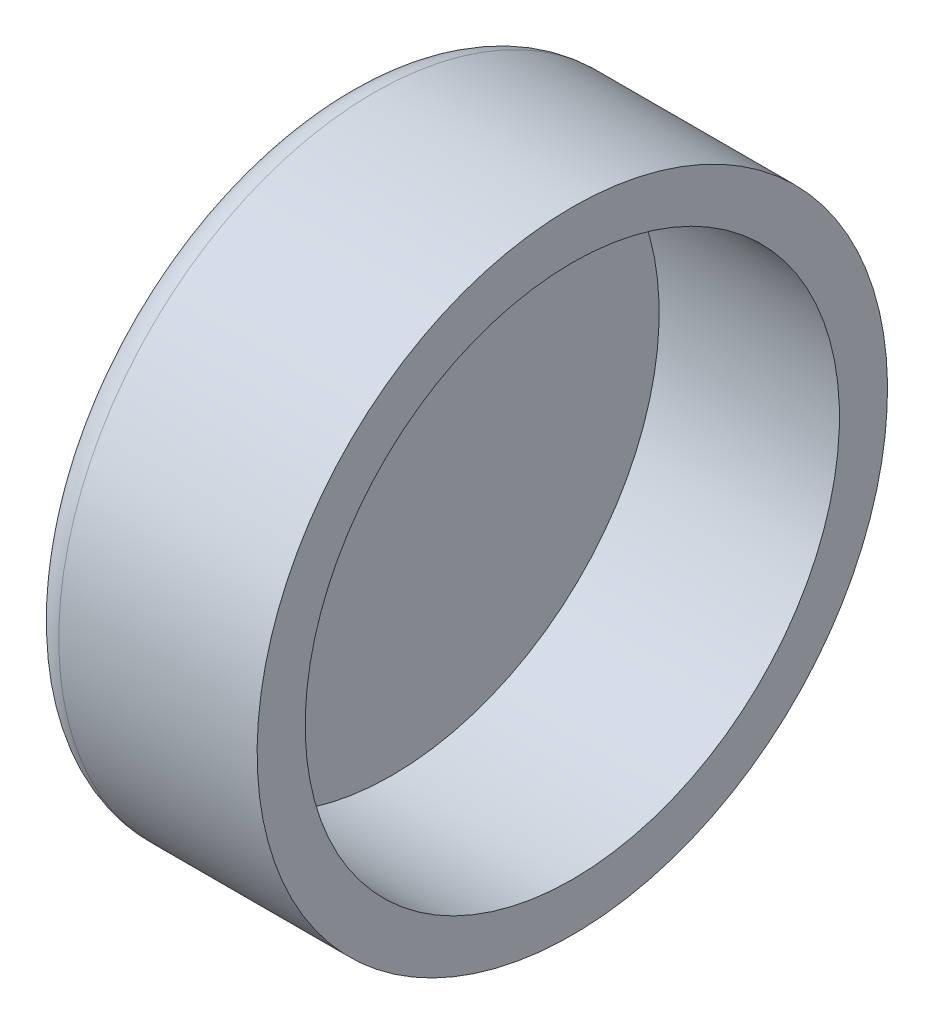
ISO-10303-21;
HEADER;
FILE_DESCRIPTION(('STEP AP214'),'2;1');
FILE_NAME('part.step','',(''),(''),'','','');
FILE_SCHEMA(('AUTOMOTIVE_DESIGN { 1 0 10303 214 1 1 1 1 }'));
ENDSEC;
DATA;
#1=APPLICATION_CONTEXT('core data for automotive mechanical design processes');
#2=APPLICATION_PROTOCOL_DEFINITION('international standard','automotive_design',2000,#1);
#3=PRODUCT_CONTEXT('',#1,'mechanical');
#4=PRODUCT('Part','Part','',(#3));
#5=PRODUCT_RELATED_PRODUCT_CATEGORY('part','',(#4));
#6=PRODUCT_DEFINITION_FORMATION('','',#4);
#7=PRODUCT_DEFINITION_CONTEXT('part definition',#1,'design');
#8=PRODUCT_DEFINITION('design','',#6,#7);
#9=PRODUCT_DEFINITION_SHAPE('','',#8);
#10=(LENGTH_UNIT() NAMED_UNIT(*) SI_UNIT(.MILLI.,.METRE.));
#11=(NAMED_UNIT(*) PLANE_ANGLE_UNIT() SI_UNIT($,.RADIAN.));
#12=(NAMED_UNIT(*) SI_UNIT($,.STERADIAN.) SOLID_ANGLE_UNIT());
#13=UNCERTAINTY_MEASURE_WITH_UNIT(LENGTH_MEASURE(1.E-05),#10,'distance_accuracy_value','');
#14=(GEOMETRIC_REPRESENTATION_CONTEXT(3) GLOBAL_UNCERTAINTY_ASSIGNED_CONTEXT((#13)) GLOBAL_UNIT_ASSIGNED_CONTEXT((#10,
#11,#12)) REPRESENTATION_CONTEXT('',''));
#15=CARTESIAN_POINT('',(0.,0.,0.));
#16=DIRECTION('',(0.,0.,1.));
#17=DIRECTION('',(1.,0.,0.));
#18=AXIS2_PLACEMENT_3D('',#15,#16,#17);
#19=CARTESIAN_POINT('',(0.,44.45,0.));
#20=DIRECTION('',(1.,0.,0.));
#21=DIRECTION('',(0.,1.,0.));
#22=AXIS2_PLACEMENT_3D('',#19,#20,#21);
#23=PLANE('',#22);
#24=CARTESIAN_POINT('',(0.,0.,0.));
#25=DIRECTION('',(1.,0.,0.));
#26=DIRECTION('',(0.,1.,0.));
#27=AXIS2_PLACEMENT_3D('',#24,#25,#26);
#28=CIRCLE('',#27,52.45);
#29=CARTESIAN_POINT('',(0.,52.45,0.));
#30=VERTEX_POINT('',#29);
#31=EDGE_CURVE('E53',#30,#30,#28,.T.);
#32=ORIENTED_EDGE('',*,*,#31,.T.);
#33=EDGE_LOOP('',(#32));
#34=FACE_BOUND('',#33,.T.);
#35=CARTESIAN_POINT('',(0.,0.,0.));
#36=DIRECTION('',(1.,0.,0.));
#37=DIRECTION('',(0.,1.,0.));
#38=AXIS2_PLACEMENT_3D('',#35,#36,#37);
#39=CIRCLE('',#38,44.45);
#40=CARTESIAN_POINT('',(0.,44.45,0.));
#41=VERTEX_POINT('',#40);
#42=EDGE_CURVE('E62',#41,#41,#39,.T.);
#43=ORIENTED_EDGE('',*,*,#42,.F.);
#44=EDGE_LOOP('',(#43));
#45=FACE_BOUND('',#44,.T.);
#46=ADVANCED_FACE('F42',(#34,#45),#23,.T.);
#47=CARTESIAN_POINT('',(-30.,0.,0.));
#48=DIRECTION('',(1.,0.,0.));
#49=DIRECTION('',(0.,1.,0.));
#50=AXIS2_PLACEMENT_3D('',#47,#48,#49);
#51=CYLINDRICAL_SURFACE('',#50,52.45);
#52=CARTESIAN_POINT('',(-33.,0.,0.));
#53=DIRECTION('',(-1.,0.,0.));
#54=DIRECTION('',(0.,-1.,0.));
#55=AXIS2_PLACEMENT_3D('',#52,#53,#54);
#56=CIRCLE('',#55,52.45);
#57=CARTESIAN_POINT('',(-33.,-52.45,0.));
#58=VERTEX_POINT('',#57);
#59=EDGE_CURVE('E49',#58,#58,#56,.F.);
#60=ORIENTED_EDGE('',*,*,#59,.T.);
#61=EDGE_LOOP('',(#60));
#62=FACE_BOUND('',#61,.T.);
#63=ORIENTED_EDGE('',*,*,#31,.F.);
#64=EDGE_LOOP('',(#63));
#65=FACE_BOUND('',#64,.T.);
#66=ADVANCED_FACE('F70',(#62,#65),#51,.T.);
#67=CARTESIAN_POINT('',(-38.,52.45,0.));
#68=DIRECTION('',(-1.,0.,0.));
#69=DIRECTION('',(0.,-1.,0.));
#70=AXIS2_PLACEMENT_3D('',#67,#68,#69);
#71=PLANE('',#70);
#72=CARTESIAN_POINT('',(-38.,0.,0.));
#73=DIRECTION('',(-1.,0.,0.));
#74=DIRECTION('',(0.,-1.,0.));
#75=AXIS2_PLACEMENT_3D('',#72,#73,#74);
#76=CIRCLE('',#75,47.45);
#77=CARTESIAN_POINT('',(-38.,-47.45,0.));
#78=VERTEX_POINT('',#77);
#79=EDGE_CURVE('E12',#78,#78,#76,.T.);
#80=ORIENTED_EDGE('',*,*,#79,.T.);
#81=EDGE_LOOP('',(#80));
#82=FACE_BOUND('',#81,.T.);
#83=ADVANCED_FACE('F75',(#82),#71,.T.);
#84=CARTESIAN_POINT('',(-30.,44.45,0.));
#85=DIRECTION('',(1.,0.,0.));
#86=DIRECTION('',(0.,1.,0.));
#87=AXIS2_PLACEMENT_3D('',#84,#85,#86);
#88=PLANE('',#87);
#89=CARTESIAN_POINT('',(-30.,0.,0.));
#90=DIRECTION('',(1.,0.,0.));
#91=DIRECTION('',(0.,1.,0.));
#92=AXIS2_PLACEMENT_3D('',#89,#90,#91);
#93=CIRCLE('',#92,44.45);
#94=CARTESIAN_POINT('',(-30.,44.45,0.));
#95=VERTEX_POINT('',#94);
#96=EDGE_CURVE('E57',#95,#95,#93,.T.);
#97=ORIENTED_EDGE('',*,*,#96,.T.);
#98=EDGE_LOOP('',(#97));
#99=FACE_BOUND('',#98,.T.);
#100=ADVANCED_FACE('F80',(#99),#88,.T.);
#101=CARTESIAN_POINT('',(-30.,0.,0.));
#102=DIRECTION('',(1.,0.,0.));
#103=DIRECTION('',(0.,1.,0.));
#104=AXIS2_PLACEMENT_3D('',#101,#102,#103);
#105=CYLINDRICAL_SURFACE('',#104,44.45);
#106=ORIENTED_EDGE('',*,*,#42,.T.);
#107=EDGE_LOOP('',(#106));
#108=FACE_BOUND('',#107,.T.);
#109=ORIENTED_EDGE('',*,*,#96,.F.);
#110=EDGE_LOOP('',(#109));
#111=FACE_BOUND('',#110,.T.);
#112=ADVANCED_FACE('F66',(#108,#111),#105,.F.);
#113=CARTESIAN_POINT('',(-33.,0.,0.));
#114=DIRECTION('',(-1.,0.,0.));
#115=DIRECTION('',(0.,-1.,0.));
#116=AXIS2_PLACEMENT_3D('',#113,#114,#115);
#117=TOROIDAL_SURFACE('',#116,47.45,5.);
#118=ORIENTED_EDGE('',*,*,#79,.F.);
#119=EDGE_LOOP('',(#118));
#120=FACE_BOUND('',#119,.T.);
#121=ORIENTED_EDGE('',*,*,#59,.F.);
#122=EDGE_LOOP('',(#121));
#123=FACE_BOUND('',#122,.T.);
#124=ADVANCED_FACE('F44',(#120,#123),#117,.T.);
#125=CLOSED_SHELL('',(#46,#66,#83,#100,#112,#124));
#126=MANIFOLD_SOLID_BREP('B2',#125);
#127=ADVANCED_BREP_SHAPE_REPRESENTATION('',(#18,#126),#14);
#128=SHAPE_DEFINITION_REPRESENTATION(#9,#127);
ENDSEC;
END-ISO-10303-21;
